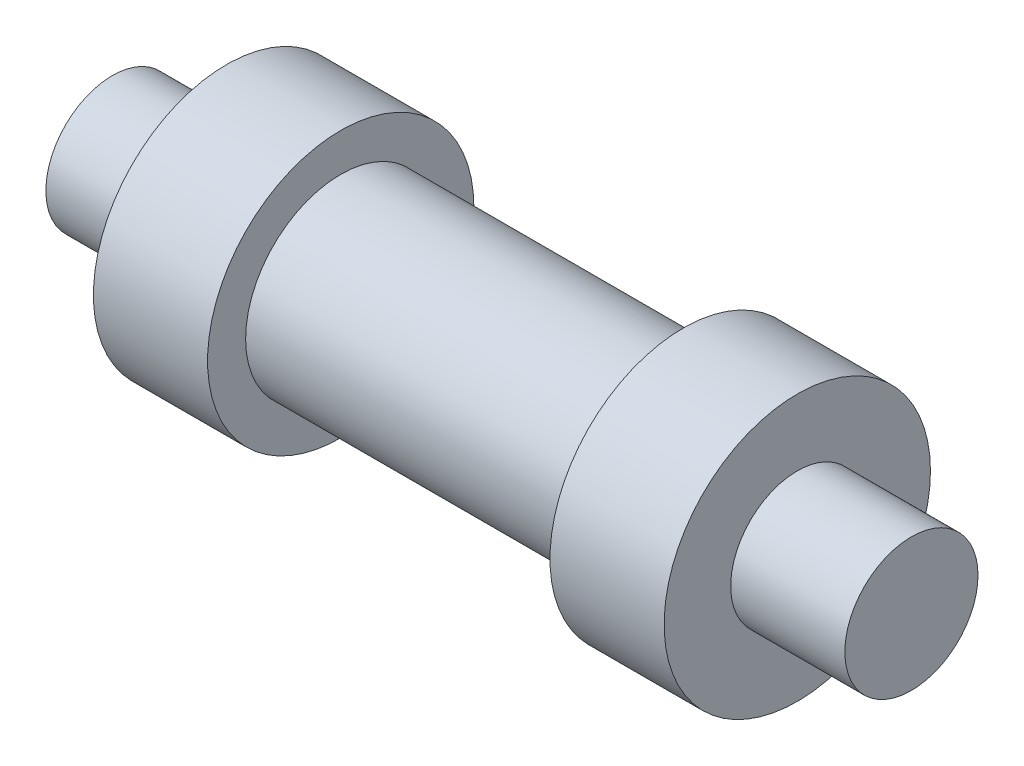
ISO-10303-21;
HEADER;
FILE_DESCRIPTION(('STEP AP214'),'2;1');
FILE_NAME('part.step','',(''),(''),'','','');
FILE_SCHEMA(('AUTOMOTIVE_DESIGN { 1 0 10303 214 1 1 1 1 }'));
ENDSEC;
DATA;
#1=APPLICATION_CONTEXT('core data for automotive mechanical design processes');
#2=APPLICATION_PROTOCOL_DEFINITION('international standard','automotive_design',2000,#1);
#3=PRODUCT_CONTEXT('',#1,'mechanical');
#4=PRODUCT('Part','Part','',(#3));
#5=PRODUCT_RELATED_PRODUCT_CATEGORY('part','',(#4));
#6=PRODUCT_DEFINITION_FORMATION('','',#4);
#7=PRODUCT_DEFINITION_CONTEXT('part definition',#1,'design');
#8=PRODUCT_DEFINITION('design','',#6,#7);
#9=PRODUCT_DEFINITION_SHAPE('','',#8);
#10=(LENGTH_UNIT() NAMED_UNIT(*) SI_UNIT(.MILLI.,.METRE.));
#11=(NAMED_UNIT(*) PLANE_ANGLE_UNIT() SI_UNIT($,.RADIAN.));
#12=(NAMED_UNIT(*) SI_UNIT($,.STERADIAN.) SOLID_ANGLE_UNIT());
#13=UNCERTAINTY_MEASURE_WITH_UNIT(LENGTH_MEASURE(1.E-05),#10,'distance_accuracy_value','');
#14=(GEOMETRIC_REPRESENTATION_CONTEXT(3) GLOBAL_UNCERTAINTY_ASSIGNED_CONTEXT((#13)) GLOBAL_UNIT_ASSIGNED_CONTEXT((#10,
#11,#12)) REPRESENTATION_CONTEXT('',''));
#15=CARTESIAN_POINT('',(0.,0.,0.));
#16=DIRECTION('',(0.,0.,1.));
#17=DIRECTION('',(1.,0.,0.));
#18=AXIS2_PLACEMENT_3D('',#15,#16,#17);
#19=CARTESIAN_POINT('',(-15.,3.5,0.));
#20=DIRECTION('',(-1.,0.,0.));
#21=DIRECTION('',(0.,0.,1.));
#22=AXIS2_PLACEMENT_3D('',#19,#20,#21);
#23=PLANE('',#22);
#24=CARTESIAN_POINT('',(-15.,0.,0.));
#25=DIRECTION('',(1.,0.,0.));
#26=DIRECTION('',(0.,0.,-1.));
#27=AXIS2_PLACEMENT_3D('',#24,#25,#26);
#28=CIRCLE('',#27,3.5);
#29=CARTESIAN_POINT('',(-15.,0.,-3.5));
#30=VERTEX_POINT('',#29);
#31=EDGE_CURVE('E71',#30,#30,#28,.T.);
#32=ORIENTED_EDGE('',*,*,#31,.T.);
#33=EDGE_LOOP('',(#32));
#34=FACE_BOUND('',#33,.T.);
#35=CARTESIAN_POINT('',(-15.,0.,0.));
#36=DIRECTION('',(1.,0.,0.));
#37=DIRECTION('',(0.,0.,-1.));
#38=AXIS2_PLACEMENT_3D('',#35,#36,#37);
#39=CIRCLE('',#38,6.99999999999999);
#40=CARTESIAN_POINT('',(-15.,0.,-6.99999999999999));
#41=VERTEX_POINT('',#40);
#42=EDGE_CURVE('E10',#41,#41,#39,.T.);
#43=ORIENTED_EDGE('',*,*,#42,.F.);
#44=EDGE_LOOP('',(#43));
#45=FACE_BOUND('',#44,.T.);
#46=ADVANCED_FACE('F40',(#34,#45),#23,.T.);
#47=CARTESIAN_POINT('',(21.,0.,0.));
#48=DIRECTION('',(1.,0.,0.));
#49=DIRECTION('',(0.,0.,-1.));
#50=AXIS2_PLACEMENT_3D('',#47,#48,#49);
#51=CYLINDRICAL_SURFACE('',#50,6.99999999999999);
#52=ORIENTED_EDGE('',*,*,#42,.T.);
#53=EDGE_LOOP('',(#52));
#54=FACE_BOUND('',#53,.T.);
#55=CARTESIAN_POINT('',(-9.00000000000001,0.,0.));
#56=DIRECTION('',(1.,0.,0.));
#57=DIRECTION('',(0.,0.,-1.));
#58=AXIS2_PLACEMENT_3D('',#55,#56,#57);
#59=CIRCLE('',#58,6.99999999999999);
#60=CARTESIAN_POINT('',(-9.00000000000001,0.,-6.99999999999999));
#61=VERTEX_POINT('',#60);
#62=EDGE_CURVE('E43',#61,#61,#59,.T.);
#63=ORIENTED_EDGE('',*,*,#62,.F.);
#64=EDGE_LOOP('',(#63));
#65=FACE_BOUND('',#64,.T.);
#66=ADVANCED_FACE('F87',(#54,#65),#51,.T.);
#67=CARTESIAN_POINT('',(-9.,6.99999999999999,0.));
#68=DIRECTION('',(1.,0.,0.));
#69=DIRECTION('',(0.,0.,-1.));
#70=AXIS2_PLACEMENT_3D('',#67,#68,#69);
#71=PLANE('',#70);
#72=ORIENTED_EDGE('',*,*,#62,.T.);
#73=EDGE_LOOP('',(#72));
#74=FACE_BOUND('',#73,.T.);
#75=CARTESIAN_POINT('',(-9.00000000000001,0.,0.));
#76=DIRECTION('',(1.,0.,0.));
#77=DIRECTION('',(0.,0.,-1.));
#78=AXIS2_PLACEMENT_3D('',#75,#76,#77);
#79=CIRCLE('',#78,5.);
#80=CARTESIAN_POINT('',(-9.00000000000001,0.,-5.));
#81=VERTEX_POINT('',#80);
#82=EDGE_CURVE('E50',#81,#81,#79,.T.);
#83=ORIENTED_EDGE('',*,*,#82,.F.);
#84=EDGE_LOOP('',(#83));
#85=FACE_BOUND('',#84,.T.);
#86=ADVANCED_FACE('F93',(#74,#85),#71,.T.);
#87=CARTESIAN_POINT('',(21.,0.,0.));
#88=DIRECTION('',(1.,0.,0.));
#89=DIRECTION('',(0.,0.,-1.));
#90=AXIS2_PLACEMENT_3D('',#87,#88,#89);
#91=CYLINDRICAL_SURFACE('',#90,5.);
#92=ORIENTED_EDGE('',*,*,#82,.T.);
#93=EDGE_LOOP('',(#92));
#94=FACE_BOUND('',#93,.T.);
#95=CARTESIAN_POINT('',(9.,0.,0.));
#96=DIRECTION('',(1.,0.,0.));
#97=DIRECTION('',(0.,0.,-1.));
#98=AXIS2_PLACEMENT_3D('',#95,#96,#97);
#99=CIRCLE('',#98,5.);
#100=CARTESIAN_POINT('',(9.,0.,-5.));
#101=VERTEX_POINT('',#100);
#102=EDGE_CURVE('E51',#101,#101,#99,.T.);
#103=ORIENTED_EDGE('',*,*,#102,.F.);
#104=EDGE_LOOP('',(#103));
#105=FACE_BOUND('',#104,.T.);
#106=ADVANCED_FACE('F100',(#94,#105),#91,.T.);
#107=CARTESIAN_POINT('',(9.,5.,0.));
#108=DIRECTION('',(-1.,0.,0.));
#109=DIRECTION('',(0.,0.,1.));
#110=AXIS2_PLACEMENT_3D('',#107,#108,#109);
#111=PLANE('',#110);
#112=ORIENTED_EDGE('',*,*,#102,.T.);
#113=EDGE_LOOP('',(#112));
#114=FACE_BOUND('',#113,.T.);
#115=CARTESIAN_POINT('',(9.,0.,0.));
#116=DIRECTION('',(1.,0.,0.));
#117=DIRECTION('',(0.,0.,-1.));
#118=AXIS2_PLACEMENT_3D('',#115,#116,#117);
#119=CIRCLE('',#118,7.);
#120=CARTESIAN_POINT('',(9.,0.,-7.));
#121=VERTEX_POINT('',#120);
#122=EDGE_CURVE('E57',#121,#121,#119,.T.);
#123=ORIENTED_EDGE('',*,*,#122,.F.);
#124=EDGE_LOOP('',(#123));
#125=FACE_BOUND('',#124,.T.);
#126=ADVANCED_FACE('F104',(#114,#125),#111,.T.);
#127=CARTESIAN_POINT('',(21.,0.,0.));
#128=DIRECTION('',(1.,0.,0.));
#129=DIRECTION('',(0.,0.,-1.));
#130=AXIS2_PLACEMENT_3D('',#127,#128,#129);
#131=CYLINDRICAL_SURFACE('',#130,7.);
#132=ORIENTED_EDGE('',*,*,#122,.T.);
#133=EDGE_LOOP('',(#132));
#134=FACE_BOUND('',#133,.T.);
#135=CARTESIAN_POINT('',(15.,0.,0.));
#136=DIRECTION('',(1.,0.,0.));
#137=DIRECTION('',(0.,0.,-1.));
#138=AXIS2_PLACEMENT_3D('',#135,#136,#137);
#139=CIRCLE('',#138,7.);
#140=CARTESIAN_POINT('',(15.,0.,-7.));
#141=VERTEX_POINT('',#140);
#142=EDGE_CURVE('E56',#141,#141,#139,.T.);
#143=ORIENTED_EDGE('',*,*,#142,.F.);
#144=EDGE_LOOP('',(#143));
#145=FACE_BOUND('',#144,.T.);
#146=ADVANCED_FACE('F107',(#134,#145),#131,.T.);
#147=CARTESIAN_POINT('',(15.,7.,0.));
#148=DIRECTION('',(1.,0.,0.));
#149=DIRECTION('',(0.,0.,-1.));
#150=AXIS2_PLACEMENT_3D('',#147,#148,#149);
#151=PLANE('',#150);
#152=ORIENTED_EDGE('',*,*,#142,.T.);
#153=EDGE_LOOP('',(#152));
#154=FACE_BOUND('',#153,.T.);
#155=CARTESIAN_POINT('',(15.,0.,0.));
#156=DIRECTION('',(1.,0.,0.));
#157=DIRECTION('',(0.,0.,-1.));
#158=AXIS2_PLACEMENT_3D('',#155,#156,#157);
#159=CIRCLE('',#158,3.5);
#160=CARTESIAN_POINT('',(15.,0.,-3.5));
#161=VERTEX_POINT('',#160);
#162=EDGE_CURVE('E62',#161,#161,#159,.T.);
#163=ORIENTED_EDGE('',*,*,#162,.F.);
#164=EDGE_LOOP('',(#163));
#165=FACE_BOUND('',#164,.T.);
#166=ADVANCED_FACE('F112',(#154,#165),#151,.T.);
#167=CARTESIAN_POINT('',(21.,0.,0.));
#168=DIRECTION('',(1.,0.,0.));
#169=DIRECTION('',(0.,0.,-1.));
#170=AXIS2_PLACEMENT_3D('',#167,#168,#169);
#171=CYLINDRICAL_SURFACE('',#170,3.5);
#172=ORIENTED_EDGE('',*,*,#162,.T.);
#173=EDGE_LOOP('',(#172));
#174=FACE_BOUND('',#173,.T.);
#175=CARTESIAN_POINT('',(21.,0.,0.));
#176=DIRECTION('',(1.,0.,0.));
#177=DIRECTION('',(0.,0.,-1.));
#178=AXIS2_PLACEMENT_3D('',#175,#176,#177);
#179=CIRCLE('',#178,3.5);
#180=CARTESIAN_POINT('',(21.,0.,-3.5));
#181=VERTEX_POINT('',#180);
#182=EDGE_CURVE('E65',#181,#181,#179,.T.);
#183=ORIENTED_EDGE('',*,*,#182,.F.);
#184=EDGE_LOOP('',(#183));
#185=FACE_BOUND('',#184,.T.);
#186=ADVANCED_FACE('F113',(#174,#185),#171,.T.);
#187=CARTESIAN_POINT('',(21.,3.5,0.));
#188=DIRECTION('',(1.,0.,0.));
#189=DIRECTION('',(0.,0.,-1.));
#190=AXIS2_PLACEMENT_3D('',#187,#188,#189);
#191=PLANE('',#190);
#192=ORIENTED_EDGE('',*,*,#182,.T.);
#193=EDGE_LOOP('',(#192));
#194=FACE_BOUND('',#193,.T.);
#195=ADVANCED_FACE('F82',(#194),#191,.T.);
#196=CARTESIAN_POINT('',(-21.,0.,0.));
#197=DIRECTION('',(-1.,0.,0.));
#198=DIRECTION('',(0.,0.,1.));
#199=AXIS2_PLACEMENT_3D('',#196,#197,#198);
#200=PLANE('',#199);
#201=CARTESIAN_POINT('',(-21.,0.,0.));
#202=DIRECTION('',(1.,0.,0.));
#203=DIRECTION('',(0.,0.,-1.));
#204=AXIS2_PLACEMENT_3D('',#201,#202,#203);
#205=CIRCLE('',#204,3.5);
#206=CARTESIAN_POINT('',(-21.,0.,-3.5));
#207=VERTEX_POINT('',#206);
#208=EDGE_CURVE('E66',#207,#207,#205,.T.);
#209=ORIENTED_EDGE('',*,*,#208,.F.);
#210=EDGE_LOOP('',(#209));
#211=FACE_BOUND('',#210,.T.);
#212=ADVANCED_FACE('F80',(#211),#200,.T.);
#213=CARTESIAN_POINT('',(21.,0.,0.));
#214=DIRECTION('',(1.,0.,0.));
#215=DIRECTION('',(0.,0.,-1.));
#216=AXIS2_PLACEMENT_3D('',#213,#214,#215);
#217=CYLINDRICAL_SURFACE('',#216,3.5);
#218=ORIENTED_EDGE('',*,*,#208,.T.);
#219=EDGE_LOOP('',(#218));
#220=FACE_BOUND('',#219,.T.);
#221=ORIENTED_EDGE('',*,*,#31,.F.);
#222=EDGE_LOOP('',(#221));
#223=FACE_BOUND('',#222,.T.);
#224=ADVANCED_FACE('F77',(#220,#223),#217,.T.);
#225=CLOSED_SHELL('',(#46,#66,#86,#106,#126,#146,#166,#186,#195,#212,#224));
#226=MANIFOLD_SOLID_BREP('B2',#225);
#227=ADVANCED_BREP_SHAPE_REPRESENTATION('',(#18,#226),#14);
#228=SHAPE_DEFINITION_REPRESENTATION(#9,#227);
ENDSEC;
END-ISO-10303-21;
